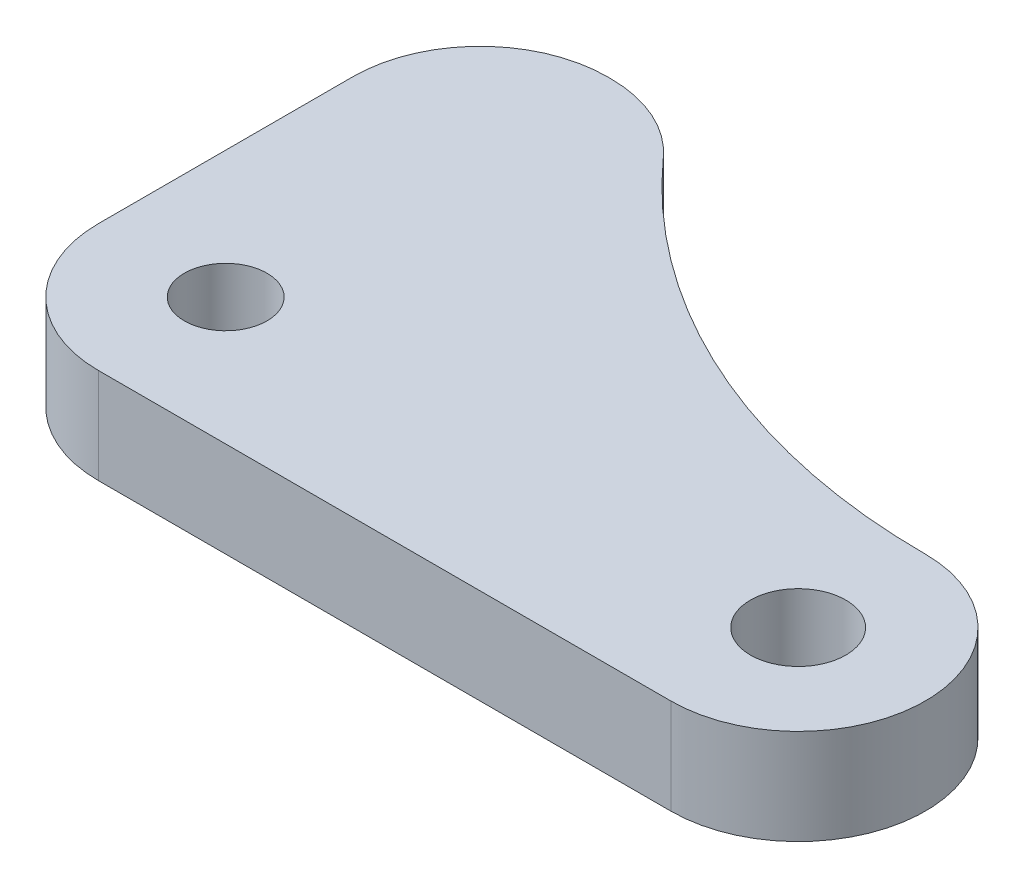
ISO-10303-21;
HEADER;
FILE_DESCRIPTION(('STEP AP214'),'2;1');
FILE_NAME('part.step','',(''),(''),'','','');
FILE_SCHEMA(('AUTOMOTIVE_DESIGN { 1 0 10303 214 1 1 1 1 }'));
ENDSEC;
DATA;
#1=APPLICATION_CONTEXT('core data for automotive mechanical design processes');
#2=APPLICATION_PROTOCOL_DEFINITION('international standard','automotive_design',2000,#1);
#3=PRODUCT_CONTEXT('',#1,'mechanical');
#4=PRODUCT('Part','Part','',(#3));
#5=PRODUCT_RELATED_PRODUCT_CATEGORY('part','',(#4));
#6=PRODUCT_DEFINITION_FORMATION('','',#4);
#7=PRODUCT_DEFINITION_CONTEXT('part definition',#1,'design');
#8=PRODUCT_DEFINITION('design','',#6,#7);
#9=PRODUCT_DEFINITION_SHAPE('','',#8);
#10=(LENGTH_UNIT() NAMED_UNIT(*) SI_UNIT(.MILLI.,.METRE.));
#11=(NAMED_UNIT(*) PLANE_ANGLE_UNIT() SI_UNIT($,.RADIAN.));
#12=(NAMED_UNIT(*) SI_UNIT($,.STERADIAN.) SOLID_ANGLE_UNIT());
#13=UNCERTAINTY_MEASURE_WITH_UNIT(LENGTH_MEASURE(1.E-05),#10,'distance_accuracy_value','');
#14=(GEOMETRIC_REPRESENTATION_CONTEXT(3) GLOBAL_UNCERTAINTY_ASSIGNED_CONTEXT((#13)) GLOBAL_UNIT_ASSIGNED_CONTEXT((#10,
#11,#12)) REPRESENTATION_CONTEXT('',''));
#15=CARTESIAN_POINT('',(0.,0.,0.));
#16=DIRECTION('',(0.,0.,1.));
#17=DIRECTION('',(1.,0.,0.));
#18=AXIS2_PLACEMENT_3D('',#15,#16,#17);
#19=CARTESIAN_POINT('',(-9.,3.,0.));
#20=DIRECTION('',(0.,-1.,0.));
#21=DIRECTION('',(0.,0.,-1.));
#22=AXIS2_PLACEMENT_3D('',#19,#20,#21);
#23=CYLINDRICAL_SURFACE('',#22,4.);
#24=CARTESIAN_POINT('',(-9.,0.,0.));
#25=DIRECTION('',(0.,1.,0.));
#26=DIRECTION('',(0.,0.,1.));
#27=AXIS2_PLACEMENT_3D('',#24,#25,#26);
#28=CIRCLE('',#27,4.);
#29=CARTESIAN_POINT('',(-13.,0.,0.));
#30=VERTEX_POINT('',#29);
#31=CARTESIAN_POINT('',(-9.,0.,4.));
#32=VERTEX_POINT('',#31);
#33=EDGE_CURVE('E130',#30,#32,#28,.T.);
#34=ORIENTED_EDGE('',*,*,#33,.T.);
#35=DIRECTION('',(0.,-1.,0.));
#36=VECTOR('',#35,1.);
#37=CARTESIAN_POINT('',(-9.,3.,4.));
#38=LINE('',#37,#36);
#39=CARTESIAN_POINT('',(-9.,3.,4.));
#40=VERTEX_POINT('',#39);
#41=EDGE_CURVE('E11',#40,#32,#38,.T.);
#42=ORIENTED_EDGE('',*,*,#41,.F.);
#43=CARTESIAN_POINT('',(-9.,3.,0.));
#44=DIRECTION('',(0.,1.,0.));
#45=DIRECTION('',(0.,0.,1.));
#46=AXIS2_PLACEMENT_3D('',#43,#44,#45);
#47=CIRCLE('',#46,4.);
#48=CARTESIAN_POINT('',(-13.,3.,0.));
#49=VERTEX_POINT('',#48);
#50=EDGE_CURVE('E145',#49,#40,#47,.T.);
#51=ORIENTED_EDGE('',*,*,#50,.F.);
#52=DIRECTION('',(0.,-1.,0.));
#53=VECTOR('',#52,1.);
#54=CARTESIAN_POINT('',(-13.,3.,0.));
#55=LINE('',#54,#53);
#56=EDGE_CURVE('E126',#49,#30,#55,.T.);
#57=ORIENTED_EDGE('',*,*,#56,.T.);
#58=EDGE_LOOP('',(#34,#42,#51,#57));
#59=FACE_BOUND('',#58,.T.);
#60=ADVANCED_FACE('F34',(#59),#23,.T.);
#61=CARTESIAN_POINT('',(-9.,3.,4.));
#62=DIRECTION('',(0.,0.,-1.));
#63=DIRECTION('',(-1.,0.,0.));
#64=AXIS2_PLACEMENT_3D('',#61,#62,#63);
#65=PLANE('',#64);
#66=DIRECTION('',(1.,0.,0.));
#67=VECTOR('',#66,1.);
#68=CARTESIAN_POINT('',(-9.,0.,4.));
#69=LINE('',#68,#67);
#70=CARTESIAN_POINT('',(9.,0.,4.));
#71=VERTEX_POINT('',#70);
#72=EDGE_CURVE('E133',#32,#71,#69,.T.);
#73=ORIENTED_EDGE('',*,*,#72,.T.);
#74=DIRECTION('',(0.,-1.,0.));
#75=VECTOR('',#74,1.);
#76=CARTESIAN_POINT('',(9.,3.,4.));
#77=LINE('',#76,#75);
#78=CARTESIAN_POINT('',(9.,3.,4.));
#79=VERTEX_POINT('',#78);
#80=EDGE_CURVE('E42',#79,#71,#77,.T.);
#81=ORIENTED_EDGE('',*,*,#80,.F.);
#82=DIRECTION('',(1.,0.,0.));
#83=VECTOR('',#82,1.);
#84=CARTESIAN_POINT('',(-9.,3.,4.));
#85=LINE('',#84,#83);
#86=EDGE_CURVE('E93',#40,#79,#85,.T.);
#87=ORIENTED_EDGE('',*,*,#86,.F.);
#88=ORIENTED_EDGE('',*,*,#41,.T.);
#89=EDGE_LOOP('',(#73,#81,#87,#88));
#90=FACE_BOUND('',#89,.T.);
#91=ADVANCED_FACE('F212',(#90),#65,.F.);
#92=CARTESIAN_POINT('',(9.,3.,0.));
#93=DIRECTION('',(0.,-1.,0.));
#94=DIRECTION('',(0.,0.,-1.));
#95=AXIS2_PLACEMENT_3D('',#92,#93,#94);
#96=CYLINDRICAL_SURFACE('',#95,4.);
#97=CARTESIAN_POINT('',(9.,0.,0.));
#98=DIRECTION('',(0.,1.,0.));
#99=DIRECTION('',(0.,0.,1.));
#100=AXIS2_PLACEMENT_3D('',#97,#98,#99);
#101=CIRCLE('',#100,4.);
#102=CARTESIAN_POINT('',(9.,0.,-4.));
#103=VERTEX_POINT('',#102);
#104=EDGE_CURVE('E136',#71,#103,#101,.T.);
#105=ORIENTED_EDGE('',*,*,#104,.T.);
#106=DIRECTION('',(0.,-1.,0.));
#107=VECTOR('',#106,1.);
#108=CARTESIAN_POINT('',(9.,3.,-4.));
#109=LINE('',#108,#107);
#110=CARTESIAN_POINT('',(9.,3.,-4.));
#111=VERTEX_POINT('',#110);
#112=EDGE_CURVE('E152',#111,#103,#109,.T.);
#113=ORIENTED_EDGE('',*,*,#112,.F.);
#114=CARTESIAN_POINT('',(9.,3.,0.));
#115=DIRECTION('',(0.,1.,0.));
#116=DIRECTION('',(0.,0.,1.));
#117=AXIS2_PLACEMENT_3D('',#114,#115,#116);
#118=CIRCLE('',#117,4.);
#119=EDGE_CURVE('E160',#79,#111,#118,.T.);
#120=ORIENTED_EDGE('',*,*,#119,.F.);
#121=ORIENTED_EDGE('',*,*,#80,.T.);
#122=EDGE_LOOP('',(#105,#113,#120,#121));
#123=FACE_BOUND('',#122,.T.);
#124=ADVANCED_FACE('F158',(#123),#96,.T.);
#125=CARTESIAN_POINT('',(8.99999999999999,3.,-24.));
#126=DIRECTION('',(0.,-1.,0.));
#127=DIRECTION('',(0.,0.,-1.));
#128=AXIS2_PLACEMENT_3D('',#125,#126,#127);
#129=CYLINDRICAL_SURFACE('',#128,20.);
#130=CARTESIAN_POINT('',(8.99999999999999,0.,-24.));
#131=DIRECTION('',(0.,-1.,0.));
#132=DIRECTION('',(0.,0.,-1.));
#133=AXIS2_PLACEMENT_3D('',#130,#131,#132);
#134=CIRCLE('',#133,20.);
#135=CARTESIAN_POINT('',(-5.9071198499986,0.,-10.6666666666667));
#136=VERTEX_POINT('',#135);
#137=EDGE_CURVE('E138',#103,#136,#134,.T.);
#138=ORIENTED_EDGE('',*,*,#137,.T.);
#139=DIRECTION('',(0.,-1.,0.));
#140=VECTOR('',#139,1.);
#141=CARTESIAN_POINT('',(-5.9071198499986,3.,-10.6666666666667));
#142=LINE('',#141,#140);
#143=CARTESIAN_POINT('',(-5.9071198499986,3.,-10.6666666666667));
#144=VERTEX_POINT('',#143);
#145=EDGE_CURVE('E149',#144,#136,#142,.T.);
#146=ORIENTED_EDGE('',*,*,#145,.F.);
#147=CARTESIAN_POINT('',(8.99999999999999,3.,-24.));
#148=DIRECTION('',(0.,-1.,0.));
#149=DIRECTION('',(0.,0.,-1.));
#150=AXIS2_PLACEMENT_3D('',#147,#148,#149);
#151=CIRCLE('',#150,20.);
#152=EDGE_CURVE('E172',#111,#144,#151,.T.);
#153=ORIENTED_EDGE('',*,*,#152,.F.);
#154=ORIENTED_EDGE('',*,*,#112,.T.);
#155=EDGE_LOOP('',(#138,#146,#153,#154));
#156=FACE_BOUND('',#155,.T.);
#157=ADVANCED_FACE('F168',(#156),#129,.F.);
#158=CARTESIAN_POINT('',(-8.88854381999832,3.,-8.));
#159=DIRECTION('',(0.,-1.,0.));
#160=DIRECTION('',(0.,0.,-1.));
#161=AXIS2_PLACEMENT_3D('',#158,#159,#160);
#162=CYLINDRICAL_SURFACE('',#161,4.);
#163=CARTESIAN_POINT('',(-8.88854381999832,0.,-8.));
#164=DIRECTION('',(0.,1.,0.));
#165=DIRECTION('',(0.,0.,1.));
#166=AXIS2_PLACEMENT_3D('',#163,#164,#165);
#167=CIRCLE('',#166,4.);
#168=CARTESIAN_POINT('',(-8.88854381999833,0.,-12.));
#169=VERTEX_POINT('',#168);
#170=EDGE_CURVE('E140',#136,#169,#167,.T.);
#171=ORIENTED_EDGE('',*,*,#170,.T.);
#172=DIRECTION('',(0.,-1.,0.));
#173=VECTOR('',#172,1.);
#174=CARTESIAN_POINT('',(-8.88854381999833,3.,-12.));
#175=LINE('',#174,#173);
#176=CARTESIAN_POINT('',(-8.88854381999833,3.,-12.));
#177=VERTEX_POINT('',#176);
#178=EDGE_CURVE('E121',#177,#169,#175,.T.);
#179=ORIENTED_EDGE('',*,*,#178,.F.);
#180=CARTESIAN_POINT('',(-8.88854381999832,3.,-8.));
#181=DIRECTION('',(0.,1.,0.));
#182=DIRECTION('',(0.,0.,1.));
#183=AXIS2_PLACEMENT_3D('',#180,#181,#182);
#184=CIRCLE('',#183,4.);
#185=EDGE_CURVE('E112',#144,#177,#184,.T.);
#186=ORIENTED_EDGE('',*,*,#185,.F.);
#187=ORIENTED_EDGE('',*,*,#145,.T.);
#188=EDGE_LOOP('',(#171,#179,#186,#187));
#189=FACE_BOUND('',#188,.T.);
#190=ADVANCED_FACE('F171',(#189),#162,.T.);
#191=CARTESIAN_POINT('',(-8.88854381999833,3.,-12.));
#192=DIRECTION('',(0.,0.,1.));
#193=DIRECTION('',(1.,0.,0.));
#194=AXIS2_PLACEMENT_3D('',#191,#192,#193);
#195=PLANE('',#194);
#196=DIRECTION('',(-1.,0.,0.));
#197=VECTOR('',#196,1.);
#198=CARTESIAN_POINT('',(-8.88854381999833,0.,-12.));
#199=LINE('',#198,#197);
#200=CARTESIAN_POINT('',(-9.,0.,-12.));
#201=VERTEX_POINT('',#200);
#202=EDGE_CURVE('E120',#169,#201,#199,.T.);
#203=ORIENTED_EDGE('',*,*,#202,.T.);
#204=DIRECTION('',(0.,-1.,0.));
#205=VECTOR('',#204,1.);
#206=CARTESIAN_POINT('',(-9.,3.,-12.));
#207=LINE('',#206,#205);
#208=CARTESIAN_POINT('',(-9.,3.,-12.));
#209=VERTEX_POINT('',#208);
#210=EDGE_CURVE('E117',#209,#201,#207,.T.);
#211=ORIENTED_EDGE('',*,*,#210,.F.);
#212=DIRECTION('',(-1.,0.,0.));
#213=VECTOR('',#212,1.);
#214=CARTESIAN_POINT('',(-8.88854381999833,3.,-12.));
#215=LINE('',#214,#213);
#216=EDGE_CURVE('E106',#177,#209,#215,.T.);
#217=ORIENTED_EDGE('',*,*,#216,.F.);
#218=ORIENTED_EDGE('',*,*,#178,.T.);
#219=EDGE_LOOP('',(#203,#211,#217,#218));
#220=FACE_BOUND('',#219,.T.);
#221=ADVANCED_FACE('F118',(#220),#195,.F.);
#222=CARTESIAN_POINT('',(-9.,3.,-8.));
#223=DIRECTION('',(0.,-1.,0.));
#224=DIRECTION('',(0.,0.,-1.));
#225=AXIS2_PLACEMENT_3D('',#222,#223,#224);
#226=CYLINDRICAL_SURFACE('',#225,4.);
#227=CARTESIAN_POINT('',(-9.,0.,-8.));
#228=DIRECTION('',(0.,1.,0.));
#229=DIRECTION('',(0.,0.,1.));
#230=AXIS2_PLACEMENT_3D('',#227,#228,#229);
#231=CIRCLE('',#230,4.);
#232=CARTESIAN_POINT('',(-13.,0.,-8.));
#233=VERTEX_POINT('',#232);
#234=EDGE_CURVE('E79',#201,#233,#231,.T.);
#235=ORIENTED_EDGE('',*,*,#234,.T.);
#236=DIRECTION('',(0.,-1.,0.));
#237=VECTOR('',#236,1.);
#238=CARTESIAN_POINT('',(-13.,3.,-8.));
#239=LINE('',#238,#237);
#240=CARTESIAN_POINT('',(-13.,3.,-8.));
#241=VERTEX_POINT('',#240);
#242=EDGE_CURVE('E122',#241,#233,#239,.T.);
#243=ORIENTED_EDGE('',*,*,#242,.F.);
#244=CARTESIAN_POINT('',(-9.,3.,-8.));
#245=DIRECTION('',(0.,1.,0.));
#246=DIRECTION('',(0.,0.,1.));
#247=AXIS2_PLACEMENT_3D('',#244,#245,#246);
#248=CIRCLE('',#247,4.);
#249=EDGE_CURVE('E110',#209,#241,#248,.T.);
#250=ORIENTED_EDGE('',*,*,#249,.F.);
#251=ORIENTED_EDGE('',*,*,#210,.T.);
#252=EDGE_LOOP('',(#235,#243,#250,#251));
#253=FACE_BOUND('',#252,.T.);
#254=ADVANCED_FACE('F124',(#253),#226,.T.);
#255=CARTESIAN_POINT('',(-13.,3.,-8.));
#256=DIRECTION('',(1.,0.,0.));
#257=DIRECTION('',(0.,0.,-1.));
#258=AXIS2_PLACEMENT_3D('',#255,#256,#257);
#259=PLANE('',#258);
#260=DIRECTION('',(0.,0.,1.));
#261=VECTOR('',#260,1.);
#262=CARTESIAN_POINT('',(-13.,0.,-8.));
#263=LINE('',#262,#261);
#264=EDGE_CURVE('E85',#233,#30,#263,.T.);
#265=ORIENTED_EDGE('',*,*,#264,.T.);
#266=ORIENTED_EDGE('',*,*,#56,.F.);
#267=DIRECTION('',(0.,0.,1.));
#268=VECTOR('',#267,1.);
#269=CARTESIAN_POINT('',(-13.,3.,-8.));
#270=LINE('',#269,#268);
#271=EDGE_CURVE('E50',#241,#49,#270,.T.);
#272=ORIENTED_EDGE('',*,*,#271,.F.);
#273=ORIENTED_EDGE('',*,*,#242,.T.);
#274=EDGE_LOOP('',(#265,#266,#272,#273));
#275=FACE_BOUND('',#274,.T.);
#276=ADVANCED_FACE('F194',(#275),#259,.F.);
#277=CARTESIAN_POINT('',(-9.,3.,0.));
#278=DIRECTION('',(0.,1.,0.));
#279=DIRECTION('',(0.,0.,1.));
#280=AXIS2_PLACEMENT_3D('',#277,#278,#279);
#281=PLANE('',#280);
#282=CARTESIAN_POINT('',(-9.,3.,0.));
#283=DIRECTION('',(0.,1.,0.));
#284=DIRECTION('',(0.,0.,1.));
#285=AXIS2_PLACEMENT_3D('',#282,#283,#284);
#286=CIRCLE('',#285,1.3);
#287=CARTESIAN_POINT('',(-9.,3.,1.3));
#288=VERTEX_POINT('',#287);
#289=EDGE_CURVE('E186',#288,#288,#286,.T.);
#290=ORIENTED_EDGE('',*,*,#289,.F.);
#291=EDGE_LOOP('',(#290));
#292=FACE_BOUND('',#291,.T.);
#293=CARTESIAN_POINT('',(9.,3.,0.));
#294=DIRECTION('',(0.,1.,0.));
#295=DIRECTION('',(0.,0.,1.));
#296=AXIS2_PLACEMENT_3D('',#293,#294,#295);
#297=CIRCLE('',#296,1.49999999999999);
#298=CARTESIAN_POINT('',(9.,3.,1.49999999999998));
#299=VERTEX_POINT('',#298);
#300=EDGE_CURVE('E180',#299,#299,#297,.T.);
#301=ORIENTED_EDGE('',*,*,#300,.F.);
#302=EDGE_LOOP('',(#301));
#303=FACE_BOUND('',#302,.T.);
#304=ORIENTED_EDGE('',*,*,#50,.T.);
#305=ORIENTED_EDGE('',*,*,#86,.T.);
#306=ORIENTED_EDGE('',*,*,#119,.T.);
#307=ORIENTED_EDGE('',*,*,#152,.T.);
#308=ORIENTED_EDGE('',*,*,#185,.T.);
#309=ORIENTED_EDGE('',*,*,#216,.T.);
#310=ORIENTED_EDGE('',*,*,#249,.T.);
#311=ORIENTED_EDGE('',*,*,#271,.T.);
#312=EDGE_LOOP('',(#304,#305,#306,#307,#308,#309,#310,#311));
#313=FACE_BOUND('',#312,.T.);
#314=ADVANCED_FACE('F108',(#292,#303,#313),#281,.T.);
#315=CARTESIAN_POINT('',(-9.,0.,0.));
#316=DIRECTION('',(0.,1.,0.));
#317=DIRECTION('',(0.,0.,1.));
#318=AXIS2_PLACEMENT_3D('',#315,#316,#317);
#319=PLANE('',#318);
#320=CARTESIAN_POINT('',(-9.,0.,0.));
#321=DIRECTION('',(0.,1.,0.));
#322=DIRECTION('',(0.,0.,1.));
#323=AXIS2_PLACEMENT_3D('',#320,#321,#322);
#324=CIRCLE('',#323,1.3);
#325=CARTESIAN_POINT('',(-9.,0.,1.3));
#326=VERTEX_POINT('',#325);
#327=EDGE_CURVE('E183',#326,#326,#324,.T.);
#328=ORIENTED_EDGE('',*,*,#327,.T.);
#329=EDGE_LOOP('',(#328));
#330=FACE_BOUND('',#329,.T.);
#331=CARTESIAN_POINT('',(9.,0.,0.));
#332=DIRECTION('',(0.,1.,0.));
#333=DIRECTION('',(0.,0.,1.));
#334=AXIS2_PLACEMENT_3D('',#331,#332,#333);
#335=CIRCLE('',#334,1.49999999999999);
#336=CARTESIAN_POINT('',(9.,0.,1.49999999999998));
#337=VERTEX_POINT('',#336);
#338=EDGE_CURVE('E134',#337,#337,#335,.T.);
#339=ORIENTED_EDGE('',*,*,#338,.T.);
#340=EDGE_LOOP('',(#339));
#341=FACE_BOUND('',#340,.T.);
#342=ORIENTED_EDGE('',*,*,#33,.F.);
#343=ORIENTED_EDGE('',*,*,#264,.F.);
#344=ORIENTED_EDGE('',*,*,#234,.F.);
#345=ORIENTED_EDGE('',*,*,#202,.F.);
#346=ORIENTED_EDGE('',*,*,#170,.F.);
#347=ORIENTED_EDGE('',*,*,#137,.F.);
#348=ORIENTED_EDGE('',*,*,#104,.F.);
#349=ORIENTED_EDGE('',*,*,#72,.F.);
#350=EDGE_LOOP('',(#342,#343,#344,#345,#346,#347,#348,#349));
#351=FACE_BOUND('',#350,.T.);
#352=ADVANCED_FACE('F164',(#330,#341,#351),#319,.F.);
#353=CARTESIAN_POINT('',(9.,3.,0.));
#354=DIRECTION('',(0.,1.,0.));
#355=DIRECTION('',(0.,0.,1.));
#356=AXIS2_PLACEMENT_3D('',#353,#354,#355);
#357=CYLINDRICAL_SURFACE('',#356,1.49999999999999);
#358=ORIENTED_EDGE('',*,*,#338,.F.);
#359=EDGE_LOOP('',(#358));
#360=FACE_BOUND('',#359,.T.);
#361=ORIENTED_EDGE('',*,*,#300,.T.);
#362=EDGE_LOOP('',(#361));
#363=FACE_BOUND('',#362,.T.);
#364=ADVANCED_FACE('F198',(#360,#363),#357,.F.);
#365=CARTESIAN_POINT('',(-9.,3.,0.));
#366=DIRECTION('',(0.,1.,0.));
#367=DIRECTION('',(0.,0.,1.));
#368=AXIS2_PLACEMENT_3D('',#365,#366,#367);
#369=CYLINDRICAL_SURFACE('',#368,1.3);
#370=ORIENTED_EDGE('',*,*,#327,.F.);
#371=EDGE_LOOP('',(#370));
#372=FACE_BOUND('',#371,.T.);
#373=ORIENTED_EDGE('',*,*,#289,.T.);
#374=EDGE_LOOP('',(#373));
#375=FACE_BOUND('',#374,.T.);
#376=ADVANCED_FACE('F190',(#372,#375),#369,.F.);
#377=CLOSED_SHELL('',(#60,#91,#124,#157,#190,#221,#254,#276,#314,#352,#364,#376));
#378=MANIFOLD_SOLID_BREP('B2',#377);
#379=ADVANCED_BREP_SHAPE_REPRESENTATION('',(#18,#378),#14);
#380=SHAPE_DEFINITION_REPRESENTATION(#9,#379);
ENDSEC;
END-ISO-10303-21;
